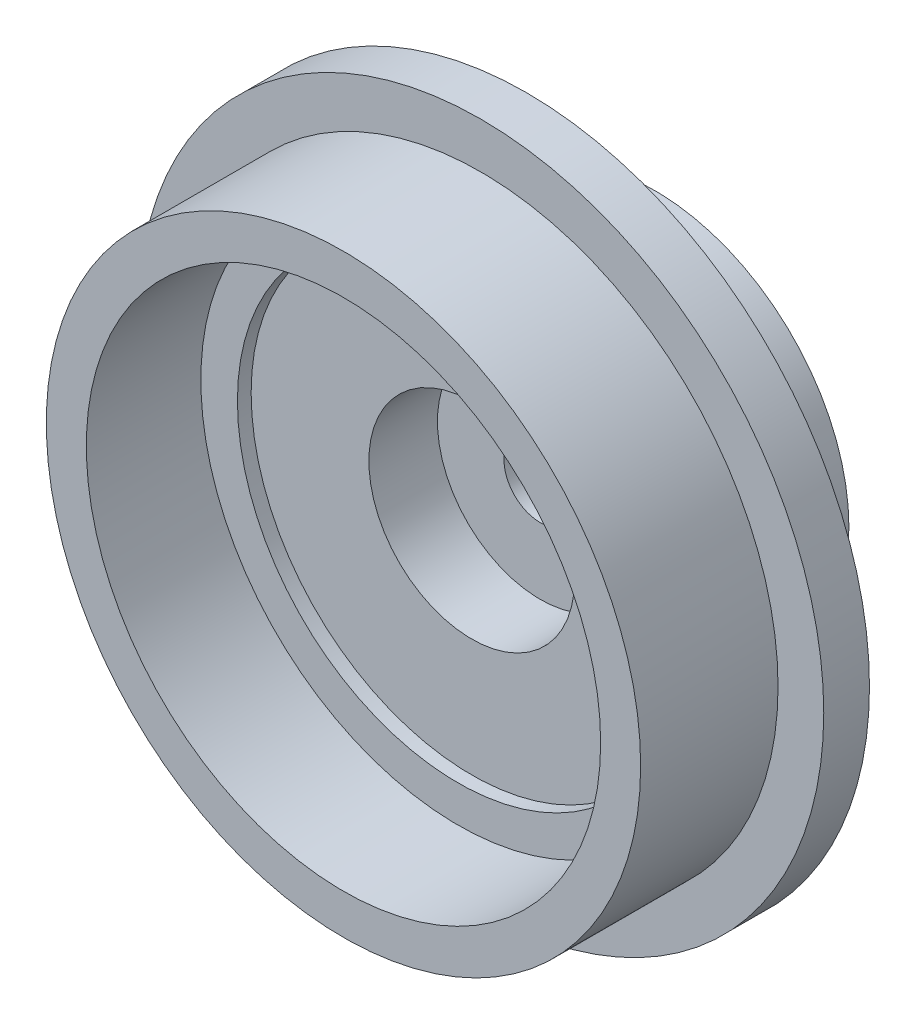
ISO-10303-21;
HEADER;
FILE_DESCRIPTION(('STEP AP214'),'2;1');
FILE_NAME('part.step','',(''),(''),'','','');
FILE_SCHEMA(('AUTOMOTIVE_DESIGN { 1 0 10303 214 1 1 1 1 }'));
ENDSEC;
DATA;
#1=APPLICATION_CONTEXT('core data for automotive mechanical design processes');
#2=APPLICATION_PROTOCOL_DEFINITION('international standard','automotive_design',2000,#1);
#3=PRODUCT_CONTEXT('',#1,'mechanical');
#4=PRODUCT('Part','Part','',(#3));
#5=PRODUCT_RELATED_PRODUCT_CATEGORY('part','',(#4));
#6=PRODUCT_DEFINITION_FORMATION('','',#4);
#7=PRODUCT_DEFINITION_CONTEXT('part definition',#1,'design');
#8=PRODUCT_DEFINITION('design','',#6,#7);
#9=PRODUCT_DEFINITION_SHAPE('','',#8);
#10=(LENGTH_UNIT() NAMED_UNIT(*) SI_UNIT(.MILLI.,.METRE.));
#11=(NAMED_UNIT(*) PLANE_ANGLE_UNIT() SI_UNIT($,.RADIAN.));
#12=(NAMED_UNIT(*) SI_UNIT($,.STERADIAN.) SOLID_ANGLE_UNIT());
#13=UNCERTAINTY_MEASURE_WITH_UNIT(LENGTH_MEASURE(1.E-05),#10,'distance_accuracy_value','');
#14=(GEOMETRIC_REPRESENTATION_CONTEXT(3) GLOBAL_UNCERTAINTY_ASSIGNED_CONTEXT((#13)) GLOBAL_UNIT_ASSIGNED_CONTEXT((#10,
#11,#12)) REPRESENTATION_CONTEXT('',''));
#15=CARTESIAN_POINT('',(0.,0.,0.));
#16=DIRECTION('',(0.,0.,1.));
#17=DIRECTION('',(1.,0.,0.));
#18=AXIS2_PLACEMENT_3D('',#15,#16,#17);
#19=CARTESIAN_POINT('',(0.,0.,-17.2847));
#20=DIRECTION('',(0.,0.,1.));
#21=DIRECTION('',(1.,0.,0.));
#22=AXIS2_PLACEMENT_3D('',#19,#20,#21);
#23=CYLINDRICAL_SURFACE('',#22,2.0193);
#24=CARTESIAN_POINT('',(0.,0.,-17.2847));
#25=DIRECTION('',(0.,0.,1.));
#26=DIRECTION('',(1.,0.,0.));
#27=AXIS2_PLACEMENT_3D('',#24,#25,#26);
#28=CIRCLE('',#27,2.0193);
#29=CARTESIAN_POINT('',(2.0193,0.,-17.2847));
#30=VERTEX_POINT('',#29);
#31=EDGE_CURVE('E72',#30,#30,#28,.T.);
#32=ORIENTED_EDGE('',*,*,#31,.F.);
#33=EDGE_LOOP('',(#32));
#34=FACE_BOUND('',#33,.T.);
#35=CARTESIAN_POINT('',(0.,0.,-10.9347));
#36=DIRECTION('',(0.,0.,1.));
#37=DIRECTION('',(1.,0.,0.));
#38=AXIS2_PLACEMENT_3D('',#35,#36,#37);
#39=CIRCLE('',#38,2.0193);
#40=CARTESIAN_POINT('',(2.0193,0.,-10.9347));
#41=VERTEX_POINT('',#40);
#42=EDGE_CURVE('E38',#41,#41,#39,.F.);
#43=ORIENTED_EDGE('',*,*,#42,.F.);
#44=EDGE_LOOP('',(#43));
#45=FACE_BOUND('',#44,.T.);
#46=ADVANCED_FACE('F34',(#34,#45),#23,.F.);
#47=CARTESIAN_POINT('',(0.,16.51,-7.6327));
#48=DIRECTION('',(0.,0.,-1.));
#49=DIRECTION('',(-1.,0.,0.));
#50=AXIS2_PLACEMENT_3D('',#47,#48,#49);
#51=PLANE('',#50);
#52=CARTESIAN_POINT('',(0.,0.,-7.6327));
#53=DIRECTION('',(0.,0.,1.));
#54=DIRECTION('',(1.,0.,0.));
#55=AXIS2_PLACEMENT_3D('',#52,#53,#54);
#56=CIRCLE('',#55,16.51);
#57=CARTESIAN_POINT('',(16.51,0.,-7.6327));
#58=VERTEX_POINT('',#57);
#59=EDGE_CURVE('E69',#58,#58,#56,.T.);
#60=ORIENTED_EDGE('',*,*,#59,.F.);
#61=EDGE_LOOP('',(#60));
#62=FACE_BOUND('',#61,.T.);
#63=CARTESIAN_POINT('',(0.,0.,-7.6327));
#64=DIRECTION('',(0.,0.,1.));
#65=DIRECTION('',(1.,0.,0.));
#66=AXIS2_PLACEMENT_3D('',#63,#64,#65);
#67=CIRCLE('',#66,19.05);
#68=CARTESIAN_POINT('',(19.05,0.,-7.6327));
#69=VERTEX_POINT('',#68);
#70=EDGE_CURVE('E10',#69,#69,#67,.T.);
#71=ORIENTED_EDGE('',*,*,#70,.T.);
#72=EDGE_LOOP('',(#71));
#73=FACE_BOUND('',#72,.T.);
#74=ADVANCED_FACE('F36',(#62,#73),#51,.F.);
#75=CARTESIAN_POINT('',(0.,0.,32.3517370738342));
#76=DIRECTION('',(0.,0.,1.));
#77=DIRECTION('',(1.,0.,0.));
#78=AXIS2_PLACEMENT_3D('',#75,#76,#77);
#79=CYLINDRICAL_SURFACE('',#78,19.05);
#80=ORIENTED_EDGE('',*,*,#70,.F.);
#81=EDGE_LOOP('',(#80));
#82=FACE_BOUND('',#81,.T.);
#83=CARTESIAN_POINT('',(0.,0.,-10.1727));
#84=DIRECTION('',(0.,0.,1.));
#85=DIRECTION('',(1.,0.,0.));
#86=AXIS2_PLACEMENT_3D('',#83,#84,#85);
#87=CIRCLE('',#86,19.05);
#88=CARTESIAN_POINT('',(19.05,0.,-10.1727));
#89=VERTEX_POINT('',#88);
#90=EDGE_CURVE('E42',#89,#89,#87,.T.);
#91=ORIENTED_EDGE('',*,*,#90,.T.);
#92=EDGE_LOOP('',(#91));
#93=FACE_BOUND('',#92,.T.);
#94=ADVANCED_FACE('F93',(#82,#93),#79,.T.);
#95=CARTESIAN_POINT('',(0.,19.05,-10.1727));
#96=DIRECTION('',(0.,0.,1.));
#97=DIRECTION('',(1.,0.,0.));
#98=AXIS2_PLACEMENT_3D('',#95,#96,#97);
#99=PLANE('',#98);
#100=ORIENTED_EDGE('',*,*,#90,.F.);
#101=EDGE_LOOP('',(#100));
#102=FACE_BOUND('',#101,.T.);
#103=CARTESIAN_POINT('',(0.,0.,-10.1727));
#104=DIRECTION('',(0.,0.,1.));
#105=DIRECTION('',(1.,0.,0.));
#106=AXIS2_PLACEMENT_3D('',#103,#104,#105);
#107=CIRCLE('',#106,10.795);
#108=CARTESIAN_POINT('',(10.795,0.,-10.1727));
#109=VERTEX_POINT('',#108);
#110=EDGE_CURVE('E46',#109,#109,#107,.T.);
#111=ORIENTED_EDGE('',*,*,#110,.T.);
#112=EDGE_LOOP('',(#111));
#113=FACE_BOUND('',#112,.T.);
#114=ADVANCED_FACE('F131',(#102,#113),#99,.F.);
#115=CARTESIAN_POINT('',(0.,0.,32.3517370738342));
#116=DIRECTION('',(0.,0.,1.));
#117=DIRECTION('',(1.,0.,0.));
#118=AXIS2_PLACEMENT_3D('',#115,#116,#117);
#119=CYLINDRICAL_SURFACE('',#118,10.795);
#120=ORIENTED_EDGE('',*,*,#110,.F.);
#121=EDGE_LOOP('',(#120));
#122=FACE_BOUND('',#121,.T.);
#123=CARTESIAN_POINT('',(0.,0.,-17.2847));
#124=DIRECTION('',(0.,0.,1.));
#125=DIRECTION('',(1.,0.,0.));
#126=AXIS2_PLACEMENT_3D('',#123,#124,#125);
#127=CIRCLE('',#126,10.795);
#128=CARTESIAN_POINT('',(10.795,0.,-17.2847));
#129=VERTEX_POINT('',#128);
#130=EDGE_CURVE('E51',#129,#129,#127,.T.);
#131=ORIENTED_EDGE('',*,*,#130,.T.);
#132=EDGE_LOOP('',(#131));
#133=FACE_BOUND('',#132,.T.);
#134=ADVANCED_FACE('F127',(#122,#133),#119,.T.);
#135=CARTESIAN_POINT('',(0.,10.795,-17.2847));
#136=DIRECTION('',(0.,0.,1.));
#137=DIRECTION('',(1.,0.,0.));
#138=AXIS2_PLACEMENT_3D('',#135,#136,#137);
#139=PLANE('',#138);
#140=ORIENTED_EDGE('',*,*,#31,.T.);
#141=EDGE_LOOP('',(#140));
#142=FACE_BOUND('',#141,.T.);
#143=ORIENTED_EDGE('',*,*,#130,.F.);
#144=EDGE_LOOP('',(#143));
#145=FACE_BOUND('',#144,.T.);
#146=ADVANCED_FACE('F123',(#142,#145),#139,.F.);
#147=CARTESIAN_POINT('',(0.,0.,-7.1247));
#148=DIRECTION('',(0.,0.,-1.));
#149=DIRECTION('',(-1.,0.,0.));
#150=AXIS2_PLACEMENT_3D('',#147,#148,#149);
#151=PLANE('',#150);
#152=CARTESIAN_POINT('',(0.,0.,-7.1247));
#153=DIRECTION('',(0.,0.,1.));
#154=DIRECTION('',(1.,0.,0.));
#155=AXIS2_PLACEMENT_3D('',#152,#153,#154);
#156=CIRCLE('',#155,5.715);
#157=CARTESIAN_POINT('',(5.715,0.,-7.1247));
#158=VERTEX_POINT('',#157);
#159=EDGE_CURVE('E75',#158,#158,#156,.T.);
#160=ORIENTED_EDGE('',*,*,#159,.F.);
#161=EDGE_LOOP('',(#160));
#162=FACE_BOUND('',#161,.T.);
#163=CARTESIAN_POINT('',(0.,0.,-7.1247));
#164=DIRECTION('',(0.,0.,1.));
#165=DIRECTION('',(1.,0.,0.));
#166=AXIS2_PLACEMENT_3D('',#163,#164,#165);
#167=CIRCLE('',#166,12.2555);
#168=CARTESIAN_POINT('',(12.2555,0.,-7.1247));
#169=VERTEX_POINT('',#168);
#170=EDGE_CURVE('E54',#169,#169,#167,.T.);
#171=ORIENTED_EDGE('',*,*,#170,.T.);
#172=EDGE_LOOP('',(#171));
#173=FACE_BOUND('',#172,.T.);
#174=ADVANCED_FACE('F119',(#162,#173),#151,.F.);
#175=CARTESIAN_POINT('',(0.,0.,32.3517370738342));
#176=DIRECTION('',(0.,0.,1.));
#177=DIRECTION('',(1.,0.,0.));
#178=AXIS2_PLACEMENT_3D('',#175,#176,#177);
#179=CYLINDRICAL_SURFACE('',#178,12.2555);
#180=ORIENTED_EDGE('',*,*,#170,.F.);
#181=EDGE_LOOP('',(#180));
#182=FACE_BOUND('',#181,.T.);
#183=CARTESIAN_POINT('',(0.,0.,-6.3627));
#184=DIRECTION('',(0.,0.,1.));
#185=DIRECTION('',(1.,0.,0.));
#186=AXIS2_PLACEMENT_3D('',#183,#184,#185);
#187=CIRCLE('',#186,12.2555);
#188=CARTESIAN_POINT('',(12.2555,0.,-6.3627));
#189=VERTEX_POINT('',#188);
#190=EDGE_CURVE('E57',#189,#189,#187,.T.);
#191=ORIENTED_EDGE('',*,*,#190,.T.);
#192=EDGE_LOOP('',(#191));
#193=FACE_BOUND('',#192,.T.);
#194=ADVANCED_FACE('F115',(#182,#193),#179,.F.);
#195=CARTESIAN_POINT('',(0.,12.2555,-6.3627));
#196=DIRECTION('',(0.,0.,-1.));
#197=DIRECTION('',(-1.,0.,0.));
#198=AXIS2_PLACEMENT_3D('',#195,#196,#197);
#199=PLANE('',#198);
#200=ORIENTED_EDGE('',*,*,#190,.F.);
#201=EDGE_LOOP('',(#200));
#202=FACE_BOUND('',#201,.T.);
#203=CARTESIAN_POINT('',(0.,0.,-6.3627));
#204=DIRECTION('',(0.,0.,1.));
#205=DIRECTION('',(1.,0.,0.));
#206=AXIS2_PLACEMENT_3D('',#203,#204,#205);
#207=CIRCLE('',#206,14.2875);
#208=CARTESIAN_POINT('',(14.2875,0.,-6.3627));
#209=VERTEX_POINT('',#208);
#210=EDGE_CURVE('E60',#209,#209,#207,.T.);
#211=ORIENTED_EDGE('',*,*,#210,.T.);
#212=EDGE_LOOP('',(#211));
#213=FACE_BOUND('',#212,.T.);
#214=ADVANCED_FACE('F111',(#202,#213),#199,.F.);
#215=CARTESIAN_POINT('',(0.,0.,32.3517370738342));
#216=DIRECTION('',(0.,0.,1.));
#217=DIRECTION('',(1.,0.,0.));
#218=AXIS2_PLACEMENT_3D('',#215,#216,#217);
#219=CYLINDRICAL_SURFACE('',#218,14.2875);
#220=ORIENTED_EDGE('',*,*,#210,.F.);
#221=EDGE_LOOP('',(#220));
#222=FACE_BOUND('',#221,.T.);
#223=CARTESIAN_POINT('',(0.,0.,0.));
#224=DIRECTION('',(0.,0.,1.));
#225=DIRECTION('',(1.,0.,0.));
#226=AXIS2_PLACEMENT_3D('',#223,#224,#225);
#227=CIRCLE('',#226,14.2875);
#228=CARTESIAN_POINT('',(14.2875,0.,0.));
#229=VERTEX_POINT('',#228);
#230=EDGE_CURVE('E63',#229,#229,#227,.T.);
#231=ORIENTED_EDGE('',*,*,#230,.T.);
#232=EDGE_LOOP('',(#231));
#233=FACE_BOUND('',#232,.T.);
#234=ADVANCED_FACE('F107',(#222,#233),#219,.F.);
#235=CARTESIAN_POINT('',(0.,14.2875,0.));
#236=DIRECTION('',(0.,0.,-1.));
#237=DIRECTION('',(-1.,0.,0.));
#238=AXIS2_PLACEMENT_3D('',#235,#236,#237);
#239=PLANE('',#238);
#240=ORIENTED_EDGE('',*,*,#230,.F.);
#241=EDGE_LOOP('',(#240));
#242=FACE_BOUND('',#241,.T.);
#243=CARTESIAN_POINT('',(0.,0.,0.));
#244=DIRECTION('',(0.,0.,1.));
#245=DIRECTION('',(1.,0.,0.));
#246=AXIS2_PLACEMENT_3D('',#243,#244,#245);
#247=CIRCLE('',#246,16.51);
#248=CARTESIAN_POINT('',(16.51,0.,0.));
#249=VERTEX_POINT('',#248);
#250=EDGE_CURVE('E66',#249,#249,#247,.T.);
#251=ORIENTED_EDGE('',*,*,#250,.T.);
#252=EDGE_LOOP('',(#251));
#253=FACE_BOUND('',#252,.T.);
#254=ADVANCED_FACE('F103',(#242,#253),#239,.F.);
#255=CARTESIAN_POINT('',(0.,0.,32.3517370738342));
#256=DIRECTION('',(0.,0.,1.));
#257=DIRECTION('',(1.,0.,0.));
#258=AXIS2_PLACEMENT_3D('',#255,#256,#257);
#259=CYLINDRICAL_SURFACE('',#258,16.51);
#260=ORIENTED_EDGE('',*,*,#250,.F.);
#261=EDGE_LOOP('',(#260));
#262=FACE_BOUND('',#261,.T.);
#263=ORIENTED_EDGE('',*,*,#59,.T.);
#264=EDGE_LOOP('',(#263));
#265=FACE_BOUND('',#264,.T.);
#266=ADVANCED_FACE('F100',(#262,#265),#259,.T.);
#267=CARTESIAN_POINT('',(0.,0.,-10.9347));
#268=DIRECTION('',(0.,0.,1.));
#269=DIRECTION('',(1.,0.,0.));
#270=AXIS2_PLACEMENT_3D('',#267,#268,#269);
#271=PLANE('',#270);
#272=CARTESIAN_POINT('',(0.,0.,-10.9347));
#273=DIRECTION('',(0.,0.,1.));
#274=DIRECTION('',(1.,0.,0.));
#275=AXIS2_PLACEMENT_3D('',#272,#273,#274);
#276=CIRCLE('',#275,5.715);
#277=CARTESIAN_POINT('',(5.715,0.,-10.9347));
#278=VERTEX_POINT('',#277);
#279=EDGE_CURVE('E78',#278,#278,#276,.T.);
#280=ORIENTED_EDGE('',*,*,#279,.T.);
#281=EDGE_LOOP('',(#280));
#282=FACE_BOUND('',#281,.T.);
#283=ORIENTED_EDGE('',*,*,#42,.T.);
#284=EDGE_LOOP('',(#283));
#285=FACE_BOUND('',#284,.T.);
#286=ADVANCED_FACE('F85',(#282,#285),#271,.T.);
#287=CARTESIAN_POINT('',(0.,0.,-10.9347));
#288=DIRECTION('',(0.,0.,1.));
#289=DIRECTION('',(1.,0.,0.));
#290=AXIS2_PLACEMENT_3D('',#287,#288,#289);
#291=CYLINDRICAL_SURFACE('',#290,5.715);
#292=CARTESIAN_POINT('',(5.715,0.,-10.9347));
#293=CARTESIAN_POINT('',(5.715,0.,-10.8950125));
#294=CARTESIAN_POINT('',(5.715,0.,-10.855325));
#295=CARTESIAN_POINT('',(5.715,0.,-10.77595));
#296=CARTESIAN_POINT('',(5.715,0.,-10.7362625));
#297=CARTESIAN_POINT('',(5.715,0.,-10.6568875));
#298=CARTESIAN_POINT('',(5.715,0.,-10.6172));
#299=CARTESIAN_POINT('',(5.715,0.,-10.537825));
#300=CARTESIAN_POINT('',(5.715,0.,-10.4981375));
#301=CARTESIAN_POINT('',(5.715,0.,-10.4187625));
#302=CARTESIAN_POINT('',(5.715,0.,-10.379075));
#303=CARTESIAN_POINT('',(5.715,0.,-10.2997));
#304=CARTESIAN_POINT('',(5.715,0.,-10.2600125));
#305=CARTESIAN_POINT('',(5.715,0.,-10.1806375));
#306=CARTESIAN_POINT('',(5.715,0.,-10.14095));
#307=CARTESIAN_POINT('',(5.715,0.,-10.061575));
#308=CARTESIAN_POINT('',(5.715,0.,-10.0218875));
#309=CARTESIAN_POINT('',(5.715,0.,-9.9425125));
#310=CARTESIAN_POINT('',(5.715,0.,-9.902825));
#311=CARTESIAN_POINT('',(5.715,0.,-9.82345));
#312=CARTESIAN_POINT('',(5.715,0.,-9.7837625));
#313=CARTESIAN_POINT('',(5.715,0.,-9.7043875));
#314=CARTESIAN_POINT('',(5.715,0.,-9.6647));
#315=CARTESIAN_POINT('',(5.715,0.,-9.585325));
#316=CARTESIAN_POINT('',(5.715,0.,-9.5456375));
#317=CARTESIAN_POINT('',(5.715,0.,-9.4662625));
#318=CARTESIAN_POINT('',(5.715,0.,-9.426575));
#319=CARTESIAN_POINT('',(5.715,0.,-9.3472));
#320=CARTESIAN_POINT('',(5.715,0.,-9.3075125));
#321=CARTESIAN_POINT('',(5.715,0.,-9.2281375));
#322=CARTESIAN_POINT('',(5.715,0.,-9.18845));
#323=CARTESIAN_POINT('',(5.715,0.,-9.109075));
#324=CARTESIAN_POINT('',(5.715,0.,-9.0693875));
#325=CARTESIAN_POINT('',(5.715,0.,-8.9900125));
#326=CARTESIAN_POINT('',(5.715,0.,-8.950325));
#327=CARTESIAN_POINT('',(5.715,0.,-8.87095));
#328=CARTESIAN_POINT('',(5.715,0.,-8.8312625));
#329=CARTESIAN_POINT('',(5.715,0.,-8.7518875));
#330=CARTESIAN_POINT('',(5.715,0.,-8.7122));
#331=CARTESIAN_POINT('',(5.715,0.,-8.632825));
#332=CARTESIAN_POINT('',(5.715,0.,-8.5931375));
#333=CARTESIAN_POINT('',(5.715,0.,-8.5137625));
#334=CARTESIAN_POINT('',(5.715,0.,-8.474075));
#335=CARTESIAN_POINT('',(5.715,0.,-8.3947));
#336=CARTESIAN_POINT('',(5.715,0.,-8.3550125));
#337=CARTESIAN_POINT('',(5.715,0.,-8.2756375));
#338=CARTESIAN_POINT('',(5.715,0.,-8.23595));
#339=CARTESIAN_POINT('',(5.715,0.,-8.156575));
#340=CARTESIAN_POINT('',(5.715,0.,-8.1168875));
#341=CARTESIAN_POINT('',(5.715,0.,-8.0375125));
#342=CARTESIAN_POINT('',(5.715,0.,-7.997825));
#343=CARTESIAN_POINT('',(5.715,0.,-7.91845));
#344=CARTESIAN_POINT('',(5.715,0.,-7.8787625));
#345=CARTESIAN_POINT('',(5.715,0.,-7.7993875));
#346=CARTESIAN_POINT('',(5.715,0.,-7.7597));
#347=CARTESIAN_POINT('',(5.715,0.,-7.680325));
#348=CARTESIAN_POINT('',(5.715,0.,-7.6406375));
#349=CARTESIAN_POINT('',(5.715,0.,-7.5612625));
#350=CARTESIAN_POINT('',(5.715,0.,-7.521575));
#351=CARTESIAN_POINT('',(5.715,0.,-7.4422));
#352=CARTESIAN_POINT('',(5.715,0.,-7.4025125));
#353=CARTESIAN_POINT('',(5.715,0.,-7.3231375));
#354=CARTESIAN_POINT('',(5.715,0.,-7.28345));
#355=CARTESIAN_POINT('',(5.715,0.,-7.204075));
#356=CARTESIAN_POINT('',(5.715,0.,-7.1643875));
#357=CARTESIAN_POINT('',(5.715,0.,-7.1247));
#358=B_SPLINE_CURVE_WITH_KNOTS('',3,(#292,#293,#294,#295,#296,#297,#298,#299,#300,#301,#302,
#303,#304,#305,#306,#307,#308,#309,#310,#311,#312,#313,#314,#315,#316,#317,#318,#319,#320,#321,
#322,#323,#324,#325,#326,#327,#328,#329,#330,#331,#332,#333,#334,#335,#336,#337,#338,#339,#340,
#341,#342,#343,#344,#345,#346,#347,#348,#349,#350,#351,#352,#353,#354,#355,#356,#357),
.UNSPECIFIED.,.F.,.F.,(4,2,2,2,2,2,2,2,2,2,2,2,2,2,2,2,2,2,2,2,2,2,2,2,2,2,2,2,2,2,2,2,4),(0.,
0.119062500000001,0.238125,0.357187500000002,0.476250000000001,0.5953125,0.714375000000001,
0.833437500000001,0.9525,1.0715625,1.190625,1.3096875,1.42875,1.5478125,1.666875,1.7859375,
1.905,2.0240625,2.143125,2.2621875,2.38125,2.5003125,2.619375,2.7384375,2.8575,2.9765625,
3.095625,3.2146875,3.33375,3.4528125,3.571875,3.6909375,3.81),.UNSPECIFIED.);
#359=EDGE_CURVE('BSEAM98',#278,#158,#358,.T.);
#360=ORIENTED_EDGE('',*,*,#279,.F.);
#361=ORIENTED_EDGE('',*,*,#159,.T.);
#362=ORIENTED_EDGE('',*,*,#359,.T.);
#363=ORIENTED_EDGE('',*,*,#359,.F.);
#364=EDGE_LOOP('',(#360,#362,#361,#363));
#365=FACE_BOUND('',#364,.T.);
#366=ADVANCED_FACE('F98',(#365),#291,.F.);
#367=CLOSED_SHELL('',(#46,#74,#94,#114,#134,#146,#174,#194,#214,#234,#254,#266,#286,#366));
#368=MANIFOLD_SOLID_BREP('B2',#367);
#369=ADVANCED_BREP_SHAPE_REPRESENTATION('',(#18,#368),#14);
#370=SHAPE_DEFINITION_REPRESENTATION(#9,#369);
ENDSEC;
END-ISO-10303-21;
